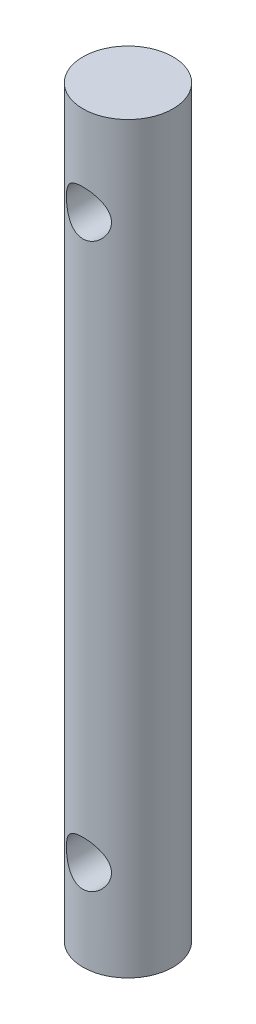
ISO-10303-21;
HEADER;
FILE_DESCRIPTION(('STEP AP214'),'2;1');
FILE_NAME('part.step','',(''),(''),'','','');
FILE_SCHEMA(('AUTOMOTIVE_DESIGN { 1 0 10303 214 1 1 1 1 }'));
ENDSEC;
DATA;
#1=APPLICATION_CONTEXT('core data for automotive mechanical design processes');
#2=APPLICATION_PROTOCOL_DEFINITION('international standard','automotive_design',2000,#1);
#3=PRODUCT_CONTEXT('',#1,'mechanical');
#4=PRODUCT('Part','Part','',(#3));
#5=PRODUCT_RELATED_PRODUCT_CATEGORY('part','',(#4));
#6=PRODUCT_DEFINITION_FORMATION('','',#4);
#7=PRODUCT_DEFINITION_CONTEXT('part definition',#1,'design');
#8=PRODUCT_DEFINITION('design','',#6,#7);
#9=PRODUCT_DEFINITION_SHAPE('','',#8);
#10=(LENGTH_UNIT() NAMED_UNIT(*) SI_UNIT(.MILLI.,.METRE.));
#11=(NAMED_UNIT(*) PLANE_ANGLE_UNIT() SI_UNIT($,.RADIAN.));
#12=(NAMED_UNIT(*) SI_UNIT($,.STERADIAN.) SOLID_ANGLE_UNIT());
#13=UNCERTAINTY_MEASURE_WITH_UNIT(LENGTH_MEASURE(1.E-05),#10,'distance_accuracy_value','');
#14=(GEOMETRIC_REPRESENTATION_CONTEXT(3) GLOBAL_UNCERTAINTY_ASSIGNED_CONTEXT((#13)) GLOBAL_UNIT_ASSIGNED_CONTEXT((#10,
#11,#12)) REPRESENTATION_CONTEXT('',''));
#15=CARTESIAN_POINT('',(0.,0.,0.));
#16=DIRECTION('',(0.,0.,1.));
#17=DIRECTION('',(1.,0.,0.));
#18=AXIS2_PLACEMENT_3D('',#15,#16,#17);
#19=CARTESIAN_POINT('',(0.,104.775,0.767844395721253));
#20=DIRECTION('',(0.,-1.,0.));
#21=DIRECTION('',(0.,0.,-1.));
#22=AXIS2_PLACEMENT_3D('',#19,#20,#21);
#23=CYLINDRICAL_SURFACE('',#22,6.35);
#24=CARTESIAN_POINT('',(0.,95.25,-5.58215560427875));
#25=CARTESIAN_POINT('',(-0.0834969220595,95.2499991122824,-5.58215491594319));
#26=CARTESIAN_POINT('',(-0.167002655580042,95.246700125554,-5.58050319339576));
#27=CARTESIAN_POINT('',(-0.333378330258781,95.2335541254501,-5.57394666249589));
#28=CARTESIAN_POINT('',(-0.416247978955772,95.2237042634742,-5.56904043894988));
#29=CARTESIAN_POINT('',(-0.66318203064701,95.184427934954,-5.549579871762));
#30=CARTESIAN_POINT('',(-0.825450146761555,95.1452749225986,-5.53028387727299));
#31=CARTESIAN_POINT('',(-1.13965128900426,95.0430092887058,-5.48107383563615));
#32=CARTESIAN_POINT('',(-1.29162180811869,94.9799897807566,-5.451201082147));
#33=CARTESIAN_POINT('',(-1.58264035037879,94.8322639263711,-5.38358372469512));
#34=CARTESIAN_POINT('',(-1.72168939123018,94.747559289849,-5.34583974143752));
#35=CARTESIAN_POINT('',(-1.99234108848171,94.5530303702658,-5.26326656610857));
#36=CARTESIAN_POINT('',(-2.12298433900091,94.4419964222061,-5.21814687698693));
#37=CARTESIAN_POINT('',(-2.36467069069853,94.2006033164272,-5.12686096018931));
#38=CARTESIAN_POINT('',(-2.4756988560132,94.0702295702336,-5.08069396496918));
#39=CARTESIAN_POINT('',(-2.68368848497886,93.7815790522467,-4.98839195362339));
#40=CARTESIAN_POINT('',(-2.77889135161933,93.6219224686984,-4.94253706604663));
#41=CARTESIAN_POINT('',(-2.90019349951534,93.3704520128256,-4.88135319714238));
#42=CARTESIAN_POINT('',(-2.93705266116891,93.2845999381713,-4.86221981233808));
#43=CARTESIAN_POINT('',(-3.00322508739606,93.1094143862936,-4.82720165281142));
#44=CARTESIAN_POINT('',(-3.03254280972159,93.0200830018194,-4.81131496011304));
#45=CARTESIAN_POINT('',(-3.08174263292982,92.8439894480352,-4.78428172062924));
#46=CARTESIAN_POINT('',(-3.10208128111978,92.7573892059714,-4.77290989565621));
#47=CARTESIAN_POINT('',(-3.13545600360765,92.5824127210056,-4.75409215314319));
#48=CARTESIAN_POINT('',(-3.14849595237257,92.4940374462283,-4.7466441527901));
#49=CARTESIAN_POINT('',(-3.1670771305344,92.3162932611514,-4.73599436210793));
#50=CARTESIAN_POINT('',(-3.17262287599649,92.2269249820126,-4.73279001454397));
#51=CARTESIAN_POINT('',(-3.17614778806993,92.0480192158219,-4.73075348826484));
#52=CARTESIAN_POINT('',(-3.17412767659871,91.9584817457286,-4.73192089240674));
#53=CARTESIAN_POINT('',(-3.1581193033026,91.7122521242756,-4.74114750790607));
#54=CARTESIAN_POINT('',(-3.13621253452965,91.5561582701866,-4.75376417785582));
#55=CARTESIAN_POINT('',(-3.07003746372168,91.2503533586935,-4.79082053480699));
#56=CARTESIAN_POINT('',(-3.02576203854504,91.1006443509772,-4.81526398785951));
#57=CARTESIAN_POINT('',(-2.91531509833647,90.8074557034358,-4.87373445835111));
#58=CARTESIAN_POINT('',(-2.84865758129417,90.6642023900634,-4.90797144304004));
#59=CARTESIAN_POINT('',(-2.69570761526054,90.390233913826,-4.98218829235508));
#60=CARTESIAN_POINT('',(-2.60940634674629,90.2595244203915,-5.02217073355679));
#61=CARTESIAN_POINT('',(-2.40685964249564,89.9968957257497,-5.10949849446486));
#62=CARTESIAN_POINT('',(-2.28820488335252,89.8669246151435,-5.15713458831811));
#63=CARTESIAN_POINT('',(-2.03058898448426,89.6279148571361,-5.2502926100278));
#64=CARTESIAN_POINT('',(-1.89161819563546,89.5188862136413,-5.29581351966033));
#65=CARTESIAN_POINT('',(-1.58913989972482,89.3200980802803,-5.38219371025555));
#66=CARTESIAN_POINT('',(-1.42479265164788,89.2314685144201,-5.42273835402447));
#67=CARTESIAN_POINT('',(-1.08098023585582,89.0838419183646,-5.49191832727827));
#68=CARTESIAN_POINT('',(-0.901527205073893,89.0248213588683,-5.5205631100682));
#69=CARTESIAN_POINT('',(-0.548533610626834,88.9429405966009,-5.56070320118232));
#70=CARTESIAN_POINT('',(-0.375734359385244,88.9174903274127,-5.5734223955087));
#71=CARTESIAN_POINT('',(-0.0278752299448305,88.8953494777397,-5.584473781442));
#72=CARTESIAN_POINT('',(0.147183538060019,88.8986452728607,-5.58281278864004));
#73=CARTESIAN_POINT('',(0.480164686080361,88.9324062359454,-5.56600095836274));
#74=CARTESIAN_POINT('',(0.638363620564189,88.9607457914748,-5.55190565488306));
#75=CARTESIAN_POINT('',(0.947441883052999,89.0404558782099,-5.51300954351996));
#76=CARTESIAN_POINT('',(1.09832040207141,89.0918289484773,-5.4882075554139));
#77=CARTESIAN_POINT('',(1.39347133182512,89.2174951309378,-5.42925558664208));
#78=CARTESIAN_POINT('',(1.53743151047822,89.2924015841112,-5.39485860038592));
#79=CARTESIAN_POINT('',(1.8112148234104,89.4623164256859,-5.32002678893539));
#80=CARTESIAN_POINT('',(1.94103189959927,89.5573333773854,-5.27958939382555));
#81=CARTESIAN_POINT('',(2.19636241342679,89.7755393503738,-5.19189163137813));
#82=CARTESIAN_POINT('',(2.32020134681979,89.9005786071116,-5.14435119678973));
#83=CARTESIAN_POINT('',(2.54589381918873,90.1697623551497,-5.05073653659243));
#84=CARTESIAN_POINT('',(2.6477321493525,90.3139199523809,-5.00466334391422));
#85=CARTESIAN_POINT('',(2.83117262876716,90.6260686019584,-4.91703095716617));
#86=CARTESIAN_POINT('',(2.91155594998014,90.7948757695104,-4.87579841869696));
#87=CARTESIAN_POINT('',(3.04191297152938,91.1463444648897,-4.80663239965195));
#88=CARTESIAN_POINT('',(3.09192585492219,91.3289877978474,-4.77868179328743));
#89=CARTESIAN_POINT('',(3.15551086037917,91.6841899564701,-4.74273326142477));
#90=CARTESIAN_POINT('',(3.17212027309711,91.8560337504072,-4.73307752771119));
#91=CARTESIAN_POINT('',(3.17718805563876,92.2002444424952,-4.73015561573233));
#92=CARTESIAN_POINT('',(3.16565862768386,92.3726110815426,-4.73688233332315));
#93=CARTESIAN_POINT('',(3.11761548073658,92.6956601030739,-4.76420771905659));
#94=CARTESIAN_POINT('',(3.08358651207686,92.8468439417311,-4.78342383504144));
#95=CARTESIAN_POINT('',(2.99458164828807,93.1411908301672,-4.83193538730456));
#96=CARTESIAN_POINT('',(2.93959901505999,93.2843512828503,-4.8612340655521));
#97=CARTESIAN_POINT('',(2.8061154442137,93.5692336994285,-4.92901136765049));
#98=CARTESIAN_POINT('',(2.7262826050393,93.7102128093657,-4.96797449908407));
#99=CARTESIAN_POINT('',(2.54682759156583,93.9776974317231,-5.04987767510257));
#100=CARTESIAN_POINT('',(2.44719512169931,94.1041953599427,-5.09281978248005));
#101=CARTESIAN_POINT('',(2.21680287661219,94.3550975241771,-5.18408314189078));
#102=CARTESIAN_POINT('',(2.08373188558712,94.4773797564128,-5.23242400305221));
#103=CARTESIAN_POINT('',(1.79751265125244,94.6983978732331,-5.32427906004625));
#104=CARTESIAN_POINT('',(1.64435365457428,94.7971210659827,-5.36779064750917));
#105=CARTESIAN_POINT('',(1.40178715704488,94.925280266197,-5.42606633618117));
#106=CARTESIAN_POINT('',(1.31842200030919,94.9648005836814,-5.44438733699258));
#107=CARTESIAN_POINT('',(1.14807701021671,95.0365994748237,-5.47810923903478));
#108=CARTESIAN_POINT('',(1.06109897786307,95.0688816065344,-5.49351157440578));
#109=CARTESIAN_POINT('',(0.884361322813114,95.125759345915,-5.52090657539856));
#110=CARTESIAN_POINT('',(0.794608244970579,95.1503717181381,-5.53290667237353));
#111=CARTESIAN_POINT('',(0.612925661591588,95.1916673895299,-5.55316543999777));
#112=CARTESIAN_POINT('',(0.520997521680293,95.2083555321935,-5.56142639596235));
#113=CARTESIAN_POINT('',(0.357531347524376,95.2306162848624,-5.57248063691209));
#114=CARTESIAN_POINT('',(0.286274046488597,95.2378788212496,-5.57610231240764));
#115=CARTESIAN_POINT('',(0.143346668941348,95.2475711265376,-5.58094012473442));
#116=CARTESIAN_POINT('',(0.0716765810914261,95.2500007620468,-5.58215619516927));
#117=CARTESIAN_POINT('',(0.,95.25,-5.58215560427875));
#118=B_SPLINE_CURVE_WITH_KNOTS('',3,(#24,#25,#26,#27,#28,#29,#30,#31,#32,#33,#34,#35,#36,#37,
#38,#39,#40,#41,#42,#43,#44,#45,#46,#47,#48,#49,#50,#51,#52,#53,#54,#55,#56,#57,#58,#59,#60,#61,
#62,#63,#64,#65,#66,#67,#68,#69,#70,#71,#72,#73,#74,#75,#76,#77,#78,#79,#80,#81,#82,#83,#84,#85,
#86,#87,#88,#89,#90,#91,#92,#93,#94,#95,#96,#97,#98,#99,#100,#101,#102,#103,#104,#105,#106,#107,
#108,#109,#110,#111,#112,#113,#114,#115,#116,#117),.UNSPECIFIED.,.T.,.F.,(4,2,2,2,2,2,2,2,2,2,2,
2,2,2,2,2,2,2,2,2,2,2,2,2,2,2,2,2,2,2,2,2,2,2,2,2,2,2,2,2,2,2,2,2,2,2,4),(0.,0.25041561210268,
0.500940186864015,1.00234854488129,1.50182051324263,2.00125310940106,2.53090025348451,
3.06094897410614,3.63210298373098,3.91787290005988,4.2034735073285,4.47213270490102,
4.74064915090149,5.00900371453887,5.27733267302576,5.74927594687737,6.22136960256845,
6.70445970327763,7.18776712794021,7.73235646527881,8.27720530143646,8.84735553323666,
9.41705196489304,9.93956405039339,10.4618285011675,10.9436138594975,11.4254523397102,
11.9210677568139,12.4168946391879,12.9614122158798,13.5063050164601,14.0775857365549,
14.6481278321882,15.1639000911419,15.6794487286237,16.1458838633213,16.6124691169503,
17.1104020806943,17.6085946442304,18.1673210354482,18.7263477502426,19.0082017078365,
19.2899168101042,19.5710117490933,19.8519346536844,20.0668939492147,20.2818591776892),.UNSPECIFIED.);
#119=CARTESIAN_POINT('',(0.,95.25,-5.58215560427875));
#120=VERTEX_POINT('',#119);
#121=EDGE_CURVE('E11',#120,#120,#118,.T.);
#122=ORIENTED_EDGE('',*,*,#121,.T.);
#123=EDGE_LOOP('',(#122));
#124=FACE_BOUND('',#123,.T.);
#125=CARTESIAN_POINT('',(3.175,92.075,6.26710570975244));
#126=CARTESIAN_POINT('',(3.17499905676822,91.9922380864674,6.26710672449038));
#127=CARTESIAN_POINT('',(3.17175738528249,91.9094660849583,6.26898254666068));
#128=CARTESIAN_POINT('',(3.15884523354688,91.7445797871413,6.2764051724258));
#129=CARTESIAN_POINT('',(3.1491717603564,91.6624658150491,6.28195368504562));
#130=CARTESIAN_POINT('',(3.11062065473092,91.4178342515892,6.30386118496228));
#131=CARTESIAN_POINT('',(3.07221261154103,91.257171953019,6.32548162314761));
#132=CARTESIAN_POINT('',(2.97211747978078,90.9464021878542,6.37963305070438));
#133=CARTESIAN_POINT('',(2.9105541372517,90.7962435598136,6.41210594158755));
#134=CARTESIAN_POINT('',(2.76627435445934,90.5083885772,6.4841998346217));
#135=CARTESIAN_POINT('',(2.68355676984061,90.3706928973657,6.52382122344217));
#136=CARTESIAN_POINT('',(2.49131627779835,90.0991761786603,6.6097447383962));
#137=CARTESIAN_POINT('',(2.38014521787044,89.9666114027183,6.65632834910434));
#138=CARTESIAN_POINT('',(2.13758083606044,89.7210292087452,6.74865491632271));
#139=CARTESIAN_POINT('',(2.00617748851801,89.608021541095,6.79439744340407));
#140=CARTESIAN_POINT('',(1.71605436473864,89.3973090471499,6.88357626918698));
#141=CARTESIAN_POINT('',(1.55609032527603,89.3011492210603,6.92664926918252));
#142=CARTESIAN_POINT('',(1.21969855929244,89.1376778568886,7.00198090719364));
#143=CARTESIAN_POINT('',(1.04328130884119,89.070348112814,7.03424636728233));
#144=CARTESIAN_POINT('',(0.692292696730408,88.9714226854615,7.08229903885362));
#145=CARTESIAN_POINT('',(0.518483183758187,88.9376252532058,7.0990953920244));
#146=CARTESIAN_POINT('',(0.166911747158865,88.8994725738218,7.11808518354362));
#147=CARTESIAN_POINT('',(-0.0108477196166699,88.8950995122434,7.12028745759956));
#148=CARTESIAN_POINT('',(-0.348718268640206,88.9150707012052,7.11031907022859));
#149=CARTESIAN_POINT('',(-0.509019820270682,88.9369507432159,7.09938163576222));
#150=CARTESIAN_POINT('',(-0.823321212955324,89.0043966354579,7.0662266872537));
#151=CARTESIAN_POINT('',(-0.97732058152526,89.0499642580866,7.04400832913163));
#152=CARTESIAN_POINT('',(-1.27733236684466,89.1637873140228,6.98994214806943));
#153=CARTESIAN_POINT('',(-1.42320480220676,89.2323479205207,6.95796535032441));
#154=CARTESIAN_POINT('',(-1.70172616219331,89.3897857200159,6.88726471977041));
#155=CARTESIAN_POINT('',(-1.83437032813194,89.4786701866477,6.84853847260754));
#156=CARTESIAN_POINT('',(-2.09605211974366,89.683895301586,6.76365365642933));
#157=CARTESIAN_POINT('',(-2.22356359612796,89.8020370904291,6.71713856499948));
#158=CARTESIAN_POINT('',(-2.45777846555886,90.0575623935202,6.62427072879643));
#159=CARTESIAN_POINT('',(-2.56446584928023,90.1949605735396,6.5779181356239));
#160=CARTESIAN_POINT('',(-2.76069102698817,90.4959477683689,6.48741729176472));
#161=CARTESIAN_POINT('',(-2.84870951352546,90.6606459110587,6.44359595324914));
#162=CARTESIAN_POINT('',(-2.95849503046442,90.9188375661308,6.38669686987964));
#163=CARTESIAN_POINT('',(-2.99138760520284,91.0067779285117,6.36919999613122));
#164=CARTESIAN_POINT('',(-3.04938956554735,91.1857974382114,6.33783657320752));
#165=CARTESIAN_POINT('',(-3.07450375064137,91.2768746113191,6.32396778622354));
#166=CARTESIAN_POINT('',(-3.11492823782859,91.4541516314038,6.30139797159841));
#167=CARTESIAN_POINT('',(-3.13085491331031,91.5401706421334,6.29237595800693));
#168=CARTESIAN_POINT('',(-3.15556797554225,91.7135106275881,6.27829753063591));
#169=CARTESIAN_POINT('',(-3.16435807553686,91.8008309011336,6.27323905462891));
#170=CARTESIAN_POINT('',(-3.17466835867007,91.9760151488662,6.26730066102777));
#171=CARTESIAN_POINT('',(-3.17619124884848,92.0638789083904,6.26641918749866));
#172=CARTESIAN_POINT('',(-3.17195985852084,92.2393448376426,6.26885948375423));
#173=CARTESIAN_POINT('',(-3.16620606921981,92.3269470246276,6.2721809698223));
#174=CARTESIAN_POINT('',(-3.14018226453033,92.5690925856452,6.2871002800797));
#175=CARTESIAN_POINT('',(-3.11209439281023,92.7226056075286,6.30313051271152));
#176=CARTESIAN_POINT('',(-3.03433762958359,93.0223468805933,6.34612536495718));
#177=CARTESIAN_POINT('',(-2.98466174914483,93.1685727555203,6.37309352544235));
#178=CARTESIAN_POINT('',(-2.86273054239685,93.4574226266486,6.43637065361084));
#179=CARTESIAN_POINT('',(-2.78953600385262,93.5995661320318,6.47305439342265));
#180=CARTESIAN_POINT('',(-2.62346157669833,93.8703671847707,6.55130086485765));
#181=CARTESIAN_POINT('',(-2.53057157570877,93.9990177534421,6.59286609791076));
#182=CARTESIAN_POINT('',(-2.31405795861388,94.2561568715187,6.68248845012277));
#183=CARTESIAN_POINT('',(-2.18803622695198,94.3825807617025,6.73070343861806));
#184=CARTESIAN_POINT('',(-1.91580928554187,94.6131340475203,6.82365632851185));
#185=CARTESIAN_POINT('',(-1.76959728537411,94.7172559123232,6.86839305214996));
#186=CARTESIAN_POINT('',(-1.45584977269243,94.9025715266821,6.95088263717487));
#187=CARTESIAN_POINT('',(-1.28785333421912,94.9830876368263,6.98842002103909));
#188=CARTESIAN_POINT('',(-0.938283508313605,95.1139128582287,7.05064091345011));
#189=CARTESIAN_POINT('',(-0.756722200806242,95.1642484938744,7.0753357062863));
#190=CARTESIAN_POINT('',(-0.403160492410787,95.2289451905403,7.10728778154941));
#191=CARTESIAN_POINT('',(-0.231811338563334,95.2461832643018,7.11593710898784));
#192=CARTESIAN_POINT('',(0.111525009731682,95.2526773594255,7.11918203295091));
#193=CARTESIAN_POINT('',(0.283511959769308,95.2419431762855,7.11378254917615));
#194=CARTESIAN_POINT('',(0.611308110350745,95.194702940442,7.09034791348882));
#195=CARTESIAN_POINT('',(0.767436553820503,95.1599417201372,7.07316882723711));
#196=CARTESIAN_POINT('',(1.07139095342116,95.0679866606661,7.02869334372406));
#197=CARTESIAN_POINT('',(1.21921571544173,95.0107896045092,7.00139549560217));
#198=CARTESIAN_POINT('',(1.50946910032131,94.8730420621377,6.93769279716902));
#199=CARTESIAN_POINT('',(1.65139651176317,94.7915973718741,6.90094837306771));
#200=CARTESIAN_POINT('',(1.92016030444461,94.6087818456706,6.82219224151419));
#201=CARTESIAN_POINT('',(2.04698971133066,94.5074018577453,6.78017811804515));
#202=CARTESIAN_POINT('',(2.29524860659569,94.2759261687049,6.69012933822699));
#203=CARTESIAN_POINT('',(2.41488454123001,94.1439767688479,6.6419116364774));
#204=CARTESIAN_POINT('',(2.63101905620371,93.8610662694591,6.54834093636534));
#205=CARTESIAN_POINT('',(2.72749716677429,93.7100885287421,6.50299049833465));
#206=CARTESIAN_POINT('',(2.85396050304134,93.4693205187556,6.44056159682022));
#207=CARTESIAN_POINT('',(2.89354057606825,93.3852422772936,6.42041563170917));
#208=CARTESIAN_POINT('',(2.96535747654717,93.2133927754824,6.38307301647894));
#209=CARTESIAN_POINT('',(2.99759808643801,93.1256234451167,6.3658748483282));
#210=CARTESIAN_POINT('',(3.0542719435453,92.9472309915753,6.33515626365955));
#211=CARTESIAN_POINT('',(3.07872527562275,92.8566158831696,6.3216263995258));
#212=CARTESIAN_POINT('',(3.11956903021308,92.6731115214591,6.29878826592036));
#213=CARTESIAN_POINT('',(3.13596509002515,92.5802239060257,6.28947704521671));
#214=CARTESIAN_POINT('',(3.15710761797221,92.4185362512041,6.27740631722533));
#215=CARTESIAN_POINT('',(3.16381073091702,92.3500663272401,6.27355307977905));
#216=CARTESIAN_POINT('',(3.17275746355016,92.212733281387,6.26840226835251));
#217=CARTESIAN_POINT('',(3.17500078490812,92.1438701335028,6.26710486534062));
#218=CARTESIAN_POINT('',(3.175,92.075,6.26710570975244));
#219=B_SPLINE_CURVE_WITH_KNOTS('',3,(#125,#126,#127,#128,#129,#130,#131,#132,#133,#134,#135,
#136,#137,#138,#139,#140,#141,#142,#143,#144,#145,#146,#147,#148,#149,#150,#151,#152,#153,#154,
#155,#156,#157,#158,#159,#160,#161,#162,#163,#164,#165,#166,#167,#168,#169,#170,#171,#172,#173,
#174,#175,#176,#177,#178,#179,#180,#181,#182,#183,#184,#185,#186,#187,#188,#189,#190,#191,#192,
#193,#194,#195,#196,#197,#198,#199,#200,#201,#202,#203,#204,#205,#206,#207,#208,#209,#210,#211,
#212,#213,#214,#215,#216,#217,#218),.UNSPECIFIED.,.T.,.F.,(4,2,2,2,2,2,2,2,2,2,2,2,2,2,2,2,2,2,
2,2,2,2,2,2,2,2,2,2,2,2,2,2,2,2,2,2,2,2,2,2,2,2,2,2,2,2,4),(0.,0.248210314193387,
0.496536210172851,0.993616655653378,1.48807751301479,1.98256512428753,2.51783706318106,
3.05337510292795,3.62501229957991,4.19628797710271,4.72691486873111,5.25722047303094,
5.74141031613326,6.22563639342838,6.71656194871308,7.2076634753703,7.74518754975544,
8.28312325280708,8.85521994590916,9.14138502893468,9.42737318655796,9.69083660833535,
9.95416285897607,10.2173910127766,10.4806013985705,10.9489167635524,11.4173838546846,
11.9075481007329,12.3979646273261,12.9502005485241,13.5026226528976,14.0696241997013,
14.6361266987681,15.1506510247058,15.6649951955482,16.1454469295095,16.625967578846,
17.1270402751828,17.6283435455375,18.1795366185793,18.7312151251733,19.0161455987001,
19.3009288973909,19.5849716229022,19.8688153329579,20.075349152287,20.2818967868888),.UNSPECIFIED.);
#220=CARTESIAN_POINT('',(3.175,92.075,6.26710570975244));
#221=VERTEX_POINT('',#220);
#222=EDGE_CURVE('E62',#221,#221,#219,.T.);
#223=ORIENTED_EDGE('',*,*,#222,.T.);
#224=EDGE_LOOP('',(#223));
#225=FACE_BOUND('',#224,.T.);
#226=CARTESIAN_POINT('',(0.,15.875,-5.58215560427875));
#227=CARTESIAN_POINT('',(-0.0834969220594996,15.8749991122824,-5.58215491594319));
#228=CARTESIAN_POINT('',(-0.167002655580042,15.871700125554,-5.58050319339576));
#229=CARTESIAN_POINT('',(-0.33337833025878,15.8585541254501,-5.57394666249589));
#230=CARTESIAN_POINT('',(-0.416247978955771,15.8487042634742,-5.56904043894988));
#231=CARTESIAN_POINT('',(-0.663182030647009,15.809427934954,-5.549579871762));
#232=CARTESIAN_POINT('',(-0.825450146761554,15.7702749225986,-5.53028387727299));
#233=CARTESIAN_POINT('',(-1.13965128900426,15.6680092887058,-5.48107383563615));
#234=CARTESIAN_POINT('',(-1.29162180811868,15.6049897807566,-5.451201082147));
#235=CARTESIAN_POINT('',(-1.58264035037879,15.4572639263711,-5.38358372469512));
#236=CARTESIAN_POINT('',(-1.72168939123018,15.372559289849,-5.34583974143752));
#237=CARTESIAN_POINT('',(-1.99234108848171,15.1780303702658,-5.26326656610857));
#238=CARTESIAN_POINT('',(-2.12298433900091,15.0669964222061,-5.21814687698693));
#239=CARTESIAN_POINT('',(-2.36467069069853,14.8256033164272,-5.12686096018931));
#240=CARTESIAN_POINT('',(-2.47569885601321,14.6952295702336,-5.08069396496918));
#241=CARTESIAN_POINT('',(-2.68368848497886,14.4065790522467,-4.98839195362339));
#242=CARTESIAN_POINT('',(-2.77889135161933,14.2469224686984,-4.94253706604663));
#243=CARTESIAN_POINT('',(-2.90019349951534,13.9954520128256,-4.88135319714238));
#244=CARTESIAN_POINT('',(-2.93705266116891,13.9095999381713,-4.86221981233808));
#245=CARTESIAN_POINT('',(-3.00322508739606,13.7344143862936,-4.82720165281142));
#246=CARTESIAN_POINT('',(-3.03254280972158,13.6450830018194,-4.81131496011304));
#247=CARTESIAN_POINT('',(-3.08174263292982,13.4689894480353,-4.78428172062924));
#248=CARTESIAN_POINT('',(-3.10208128111978,13.3823892059714,-4.77290989565621));
#249=CARTESIAN_POINT('',(-3.13545600360764,13.2074127210056,-4.75409215314319));
#250=CARTESIAN_POINT('',(-3.14849595237257,13.1190374462283,-4.7466441527901));
#251=CARTESIAN_POINT('',(-3.1670771305344,12.9412932611514,-4.73599436210794));
#252=CARTESIAN_POINT('',(-3.17262287599649,12.8519249820126,-4.73279001454397));
#253=CARTESIAN_POINT('',(-3.17614778806993,12.6730192158219,-4.73075348826484));
#254=CARTESIAN_POINT('',(-3.17412767659871,12.5834817457287,-4.73192089240674));
#255=CARTESIAN_POINT('',(-3.1581193033026,12.3372521242756,-4.74114750790608));
#256=CARTESIAN_POINT('',(-3.13621253452965,12.1811582701866,-4.75376417785582));
#257=CARTESIAN_POINT('',(-3.07003746372167,11.8753533586935,-4.79082053480699));
#258=CARTESIAN_POINT('',(-3.02576203854504,11.7256443509772,-4.81526398785952));
#259=CARTESIAN_POINT('',(-2.91531509833646,11.4324557034359,-4.87373445835112));
#260=CARTESIAN_POINT('',(-2.84865758129417,11.2892023900634,-4.90797144304004));
#261=CARTESIAN_POINT('',(-2.69570761526053,11.015233913826,-4.98218829235508));
#262=CARTESIAN_POINT('',(-2.60940634674628,10.8845244203915,-5.02217073355679));
#263=CARTESIAN_POINT('',(-2.40685964249564,10.6218957257497,-5.10949849446486));
#264=CARTESIAN_POINT('',(-2.28820488335252,10.4919246151435,-5.15713458831811));
#265=CARTESIAN_POINT('',(-2.03058898448426,10.2529148571362,-5.2502926100278));
#266=CARTESIAN_POINT('',(-1.89161819563545,10.1438862136413,-5.29581351966033));
#267=CARTESIAN_POINT('',(-1.58913989972482,9.94509808028028,-5.38219371025555));
#268=CARTESIAN_POINT('',(-1.42479265164787,9.85646851442005,-5.42273835402447));
#269=CARTESIAN_POINT('',(-1.08098023585582,9.70884191836465,-5.49191832727827));
#270=CARTESIAN_POINT('',(-0.901527205073886,9.64982135886829,-5.52056311006821));
#271=CARTESIAN_POINT('',(-0.548533610626825,9.56794059660095,-5.56070320118232));
#272=CARTESIAN_POINT('',(-0.375734359385236,9.54249032741266,-5.5734223955087));
#273=CARTESIAN_POINT('',(-0.0278752299448229,9.52034947773974,-5.584473781442));
#274=CARTESIAN_POINT('',(0.147183538060028,9.52364527286068,-5.58281278864004));
#275=CARTESIAN_POINT('',(0.480164686080371,9.55740623594539,-5.56600095836274));
#276=CARTESIAN_POINT('',(0.638363620564199,9.58574579147484,-5.55190565488305));
#277=CARTESIAN_POINT('',(0.947441883053009,9.6654558782099,-5.51300954351996));
#278=CARTESIAN_POINT('',(1.09832040207142,9.71682894847729,-5.4882075554139));
#279=CARTESIAN_POINT('',(1.39347133182513,9.8424951309378,-5.42925558664208));
#280=CARTESIAN_POINT('',(1.53743151047823,9.9174015841112,-5.39485860038592));
#281=CARTESIAN_POINT('',(1.81121482341041,10.0873164256859,-5.32002678893539));
#282=CARTESIAN_POINT('',(1.94103189959928,10.1823333773854,-5.27958939382554));
#283=CARTESIAN_POINT('',(2.1963624134268,10.4005393503738,-5.19189163137813));
#284=CARTESIAN_POINT('',(2.32020134681981,10.5255786071116,-5.14435119678972));
#285=CARTESIAN_POINT('',(2.54589381918874,10.7947623551498,-5.05073653659243));
#286=CARTESIAN_POINT('',(2.64773214935251,10.9389199523809,-5.00466334391421));
#287=CARTESIAN_POINT('',(2.83117262876717,11.2510686019584,-4.91703095716616));
#288=CARTESIAN_POINT('',(2.91155594998015,11.4198757695104,-4.87579841869695));
#289=CARTESIAN_POINT('',(3.04191297152939,11.7713444648897,-4.80663239965194));
#290=CARTESIAN_POINT('',(3.0919258549222,11.9539877978474,-4.77868179328743));
#291=CARTESIAN_POINT('',(3.15551086037918,12.3091899564702,-4.74273326142477));
#292=CARTESIAN_POINT('',(3.17212027309712,12.4810337504072,-4.73307752771119));
#293=CARTESIAN_POINT('',(3.17718805563877,12.8252444424952,-4.73015561573233));
#294=CARTESIAN_POINT('',(3.16565862768386,12.9976110815426,-4.73688233332315));
#295=CARTESIAN_POINT('',(3.11761548073658,13.3206601030739,-4.76420771905659));
#296=CARTESIAN_POINT('',(3.08358651207687,13.4718439417311,-4.78342383504144));
#297=CARTESIAN_POINT('',(2.99458164828807,13.7661908301672,-4.83193538730456));
#298=CARTESIAN_POINT('',(2.93959901505999,13.9093512828503,-4.86123406555209));
#299=CARTESIAN_POINT('',(2.8061154442137,14.1942336994285,-4.92901136765049));
#300=CARTESIAN_POINT('',(2.72628260503929,14.3352128093657,-4.96797449908407));
#301=CARTESIAN_POINT('',(2.54682759156583,14.6026974317231,-5.04987767510257));
#302=CARTESIAN_POINT('',(2.44719512169931,14.7291953599427,-5.09281978248005));
#303=CARTESIAN_POINT('',(2.21680287661219,14.9800975241771,-5.18408314189078));
#304=CARTESIAN_POINT('',(2.08373188558713,15.1023797564128,-5.23242400305221));
#305=CARTESIAN_POINT('',(1.79751265125244,15.3233978732331,-5.32427906004625));
#306=CARTESIAN_POINT('',(1.64435365457428,15.4221210659827,-5.36779064750917));
#307=CARTESIAN_POINT('',(1.40178715704487,15.5502802661971,-5.42606633618117));
#308=CARTESIAN_POINT('',(1.31842200030919,15.5898005836814,-5.44438733699258));
#309=CARTESIAN_POINT('',(1.14807701021671,15.6615994748237,-5.47810923903478));
#310=CARTESIAN_POINT('',(1.06109897786306,15.6938816065344,-5.49351157440578));
#311=CARTESIAN_POINT('',(0.884361322813111,15.750759345915,-5.52090657539856));
#312=CARTESIAN_POINT('',(0.794608244970574,15.7753717181381,-5.53290667237353));
#313=CARTESIAN_POINT('',(0.612925661591584,15.8166673895299,-5.55316543999778));
#314=CARTESIAN_POINT('',(0.520997521680292,15.8333555321935,-5.56142639596235));
#315=CARTESIAN_POINT('',(0.357531347524376,15.8556162848624,-5.57248063691209));
#316=CARTESIAN_POINT('',(0.286274046488597,15.8628788212496,-5.57610231240764));
#317=CARTESIAN_POINT('',(0.143346668941347,15.8725711265376,-5.58094012473442));
#318=CARTESIAN_POINT('',(0.0716765810914259,15.8750007620468,-5.58215619516927));
#319=CARTESIAN_POINT('',(0.,15.875,-5.58215560427875));
#320=B_SPLINE_CURVE_WITH_KNOTS('',3,(#226,#227,#228,#229,#230,#231,#232,#233,#234,#235,#236,
#237,#238,#239,#240,#241,#242,#243,#244,#245,#246,#247,#248,#249,#250,#251,#252,#253,#254,#255,
#256,#257,#258,#259,#260,#261,#262,#263,#264,#265,#266,#267,#268,#269,#270,#271,#272,#273,#274,
#275,#276,#277,#278,#279,#280,#281,#282,#283,#284,#285,#286,#287,#288,#289,#290,#291,#292,#293,
#294,#295,#296,#297,#298,#299,#300,#301,#302,#303,#304,#305,#306,#307,#308,#309,#310,#311,#312,
#313,#314,#315,#316,#317,#318,#319),.UNSPECIFIED.,.T.,.F.,(4,2,2,2,2,2,2,2,2,2,2,2,2,2,2,2,2,2,
2,2,2,2,2,2,2,2,2,2,2,2,2,2,2,2,2,2,2,2,2,2,2,2,2,2,2,2,4),(0.,0.25041561210268,
0.500940186864013,1.00234854488129,1.50182051324263,2.00125310940106,2.53090025348452,
3.06094897410615,3.63210298373098,3.91787290005989,4.20347350732849,4.47213270490102,
4.74064915090148,5.00900371453887,5.27733267302576,5.74927594687738,6.22136960256846,
6.70445970327764,7.18776712794021,7.73235646527881,8.27720530143646,8.84735553323666,
9.41705196489304,9.93956405039339,10.4618285011675,10.9436138594975,11.4254523397102,
11.9210677568139,12.4168946391879,12.9614122158798,13.5063050164601,14.0775857365549,
14.6481278321882,15.1639000911419,15.6794487286237,16.1458838633213,16.6124691169503,
17.1104020806943,17.6085946442304,18.1673210354482,18.7263477502426,19.0082017078365,
19.2899168101042,19.5710117490933,19.8519346536844,20.0668939492148,20.2818591776892),.UNSPECIFIED.);
#321=CARTESIAN_POINT('',(0.,15.875,-5.58215560427875));
#322=VERTEX_POINT('',#321);
#323=EDGE_CURVE('E43',#322,#322,#320,.T.);
#324=ORIENTED_EDGE('',*,*,#323,.T.);
#325=EDGE_LOOP('',(#324));
#326=FACE_BOUND('',#325,.T.);
#327=CARTESIAN_POINT('',(3.17500000000001,12.7,6.26710570975244));
#328=CARTESIAN_POINT('',(3.17499905676823,12.6172380864675,6.26710672449038));
#329=CARTESIAN_POINT('',(3.1717573852825,12.5344660849583,6.26898254666067));
#330=CARTESIAN_POINT('',(3.15884523354689,12.3695797871413,6.2764051724258));
#331=CARTESIAN_POINT('',(3.14917176035641,12.2874658150492,6.28195368504562));
#332=CARTESIAN_POINT('',(3.11062065473093,12.0428342515892,6.30386118496227));
#333=CARTESIAN_POINT('',(3.07221261154103,11.882171953019,6.32548162314761));
#334=CARTESIAN_POINT('',(2.97211747978078,11.5714021878542,6.37963305070438));
#335=CARTESIAN_POINT('',(2.9105541372517,11.4212435598136,6.41210594158755));
#336=CARTESIAN_POINT('',(2.76627435445935,11.1333885772,6.4841998346217));
#337=CARTESIAN_POINT('',(2.68355676984061,10.9956928973657,6.52382122344217));
#338=CARTESIAN_POINT('',(2.49131627779835,10.7241761786603,6.6097447383962));
#339=CARTESIAN_POINT('',(2.38014521787044,10.5916114027183,6.65632834910434));
#340=CARTESIAN_POINT('',(2.13758083606043,10.3460292087452,6.74865491632271));
#341=CARTESIAN_POINT('',(2.00617748851801,10.233021541095,6.79439744340407));
#342=CARTESIAN_POINT('',(1.71605436473864,10.0223090471499,6.88357626918698));
#343=CARTESIAN_POINT('',(1.55609032527603,9.92614922106035,6.92664926918252));
#344=CARTESIAN_POINT('',(1.21969855929244,9.76267785688862,7.00198090719364));
#345=CARTESIAN_POINT('',(1.0432813088412,9.69534811281404,7.03424636728234));
#346=CARTESIAN_POINT('',(0.692292696730409,9.59642268546146,7.08229903885362));
#347=CARTESIAN_POINT('',(0.518483183758185,9.56262525320581,7.0990953920244));
#348=CARTESIAN_POINT('',(0.166911747158861,9.52447257382175,7.11808518354362));
#349=CARTESIAN_POINT('',(-0.0108477196166729,9.52009951224336,7.12028745759956));
#350=CARTESIAN_POINT('',(-0.348718268640207,9.54007070120517,7.11031907022859));
#351=CARTESIAN_POINT('',(-0.509019820270683,9.56195074321593,7.09938163576222));
#352=CARTESIAN_POINT('',(-0.823321212955323,9.62939663545795,7.0662266872537));
#353=CARTESIAN_POINT('',(-0.977320581525258,9.67496425808659,7.04400832913163));
#354=CARTESIAN_POINT('',(-1.27733236684465,9.7887873140228,6.98994214806944));
#355=CARTESIAN_POINT('',(-1.42320480220676,9.85734792052068,6.95796535032441));
#356=CARTESIAN_POINT('',(-1.7017261621933,10.0147857200159,6.88726471977041));
#357=CARTESIAN_POINT('',(-1.83437032813193,10.1036701866477,6.84853847260754));
#358=CARTESIAN_POINT('',(-2.09605211974366,10.308895301586,6.76365365642933));
#359=CARTESIAN_POINT('',(-2.22356359612796,10.4270370904291,6.71713856499948));
#360=CARTESIAN_POINT('',(-2.45777846555886,10.6825623935202,6.62427072879643));
#361=CARTESIAN_POINT('',(-2.56446584928023,10.8199605735396,6.5779181356239));
#362=CARTESIAN_POINT('',(-2.76069102698817,11.1209477683689,6.48741729176472));
#363=CARTESIAN_POINT('',(-2.84870951352546,11.2856459110587,6.44359595324915));
#364=CARTESIAN_POINT('',(-2.95849503046442,11.5438375661308,6.38669686987964));
#365=CARTESIAN_POINT('',(-2.99138760520284,11.6317779285117,6.36919999613122));
#366=CARTESIAN_POINT('',(-3.04938956554735,11.8107974382114,6.33783657320752));
#367=CARTESIAN_POINT('',(-3.07450375064137,11.9018746113191,6.32396778622355));
#368=CARTESIAN_POINT('',(-3.11492823782858,12.0791516314038,6.30139797159841));
#369=CARTESIAN_POINT('',(-3.13085491331031,12.1651706421334,6.29237595800693));
#370=CARTESIAN_POINT('',(-3.15556797554224,12.3385106275881,6.27829753063591));
#371=CARTESIAN_POINT('',(-3.16435807553685,12.4258309011336,6.27323905462891));
#372=CARTESIAN_POINT('',(-3.17466835867006,12.6010151488662,6.26730066102777));
#373=CARTESIAN_POINT('',(-3.17619124884848,12.6888789083904,6.26641918749866));
#374=CARTESIAN_POINT('',(-3.17195985852084,12.8643448376426,6.26885948375424));
#375=CARTESIAN_POINT('',(-3.16620606921981,12.9519470246276,6.2721809698223));
#376=CARTESIAN_POINT('',(-3.14018226453033,13.1940925856452,6.28710028007971));
#377=CARTESIAN_POINT('',(-3.11209439281023,13.3476056075286,6.30313051271152));
#378=CARTESIAN_POINT('',(-3.03433762958359,13.6473468805933,6.34612536495718));
#379=CARTESIAN_POINT('',(-2.98466174914483,13.7935727555203,6.37309352544235));
#380=CARTESIAN_POINT('',(-2.86273054239684,14.0824226266486,6.43637065361084));
#381=CARTESIAN_POINT('',(-2.78953600385261,14.2245661320318,6.47305439342265));
#382=CARTESIAN_POINT('',(-2.62346157669832,14.4953671847707,6.55130086485766));
#383=CARTESIAN_POINT('',(-2.53057157570876,14.6240177534421,6.59286609791076));
#384=CARTESIAN_POINT('',(-2.31405795861387,14.8811568715187,6.68248845012278));
#385=CARTESIAN_POINT('',(-2.18803622695198,15.0075807617025,6.73070343861806));
#386=CARTESIAN_POINT('',(-1.91580928554186,15.2381340475204,6.82365632851185));
#387=CARTESIAN_POINT('',(-1.76959728537411,15.3422559123232,6.86839305214996));
#388=CARTESIAN_POINT('',(-1.45584977269243,15.5275715266821,6.95088263717488));
#389=CARTESIAN_POINT('',(-1.28785333421912,15.6080876368263,6.98842002103909));
#390=CARTESIAN_POINT('',(-0.938283508313603,15.7389128582287,7.05064091345011));
#391=CARTESIAN_POINT('',(-0.756722200806239,15.7892484938744,7.0753357062863));
#392=CARTESIAN_POINT('',(-0.403160492410781,15.8539451905403,7.10728778154941));
#393=CARTESIAN_POINT('',(-0.231811338563328,15.8711832643018,7.11593710898784));
#394=CARTESIAN_POINT('',(0.111525009731688,15.8776773594255,7.11918203295091));
#395=CARTESIAN_POINT('',(0.283511959769315,15.8669431762855,7.11378254917615));
#396=CARTESIAN_POINT('',(0.611308110350751,15.819702940442,7.09034791348881));
#397=CARTESIAN_POINT('',(0.76743655382051,15.7849417201372,7.07316882723711));
#398=CARTESIAN_POINT('',(1.07139095342117,15.6929866606661,7.02869334372406));
#399=CARTESIAN_POINT('',(1.21921571544173,15.6357896045092,7.00139549560217));
#400=CARTESIAN_POINT('',(1.50946910032132,15.4980420621378,6.93769279716902));
#401=CARTESIAN_POINT('',(1.65139651176319,15.4165973718741,6.90094837306771));
#402=CARTESIAN_POINT('',(1.92016030444463,15.2337818456706,6.82219224151418));
#403=CARTESIAN_POINT('',(2.04698971133067,15.1324018577453,6.78017811804515));
#404=CARTESIAN_POINT('',(2.29524860659569,14.9009261687049,6.69012933822698));
#405=CARTESIAN_POINT('',(2.41488454123002,14.7689767688479,6.6419116364774));
#406=CARTESIAN_POINT('',(2.63101905620372,14.4860662694591,6.54834093636534));
#407=CARTESIAN_POINT('',(2.7274971667743,14.3350885287421,6.50299049833464));
#408=CARTESIAN_POINT('',(2.85396050304135,14.0943205187556,6.44056159682021));
#409=CARTESIAN_POINT('',(2.89354057606826,14.0102422772936,6.42041563170916));
#410=CARTESIAN_POINT('',(2.96535747654718,13.8383927754824,6.38307301647893));
#411=CARTESIAN_POINT('',(2.99759808643802,13.7506234451167,6.36587484832819));
#412=CARTESIAN_POINT('',(3.05427194354531,13.5722309915753,6.33515626365955));
#413=CARTESIAN_POINT('',(3.07872527562276,13.4816158831696,6.3216263995258));
#414=CARTESIAN_POINT('',(3.11956903021309,13.2981115214591,6.29878826592036));
#415=CARTESIAN_POINT('',(3.13596509002516,13.2052239060257,6.28947704521671));
#416=CARTESIAN_POINT('',(3.15710761797221,13.0435362512041,6.27740631722533));
#417=CARTESIAN_POINT('',(3.16381073091703,12.9750663272401,6.27355307977905));
#418=CARTESIAN_POINT('',(3.17275746355017,12.837733281387,6.26840226835251));
#419=CARTESIAN_POINT('',(3.17500078490813,12.7688701335028,6.26710486534062));
#420=CARTESIAN_POINT('',(3.17500000000001,12.7,6.26710570975244));
#421=B_SPLINE_CURVE_WITH_KNOTS('',3,(#327,#328,#329,#330,#331,#332,#333,#334,#335,#336,#337,
#338,#339,#340,#341,#342,#343,#344,#345,#346,#347,#348,#349,#350,#351,#352,#353,#354,#355,#356,
#357,#358,#359,#360,#361,#362,#363,#364,#365,#366,#367,#368,#369,#370,#371,#372,#373,#374,#375,
#376,#377,#378,#379,#380,#381,#382,#383,#384,#385,#386,#387,#388,#389,#390,#391,#392,#393,#394,
#395,#396,#397,#398,#399,#400,#401,#402,#403,#404,#405,#406,#407,#408,#409,#410,#411,#412,#413,
#414,#415,#416,#417,#418,#419,#420),.UNSPECIFIED.,.T.,.F.,(4,2,2,2,2,2,2,2,2,2,2,2,2,2,2,2,2,2,
2,2,2,2,2,2,2,2,2,2,2,2,2,2,2,2,2,2,2,2,2,2,2,2,2,2,2,2,4),(0.,0.248210314193369,
0.496536210172844,0.993616655653378,1.48807751301481,1.98256512428753,2.51783706318107,
3.05337510292796,3.62501229957992,4.19628797710272,4.72691486873112,5.25722047303095,
5.74141031613327,6.22563639342838,6.71656194871309,7.20766347537031,7.74518754975546,
8.28312325280709,8.85521994590916,9.14138502893469,9.42737318655796,9.69083660833536,
9.95416285897606,10.2173910127766,10.4806013985705,10.9489167635524,11.4173838546846,
11.9075481007329,12.3979646273261,12.9502005485241,13.5026226528976,14.0696241997013,
14.6361266987681,15.1506510247058,15.6649951955482,16.1454469295095,16.625967578846,
17.1270402751829,17.6283435455375,18.1795366185793,18.7312151251733,19.0161455987001,
19.3009288973909,19.5849716229022,19.8688153329579,20.075349152287,20.2818967868888),.UNSPECIFIED.);
#422=CARTESIAN_POINT('',(3.17500000000001,12.7,6.26710570975244));
#423=VERTEX_POINT('',#422);
#424=EDGE_CURVE('E58',#423,#423,#421,.T.);
#425=ORIENTED_EDGE('',*,*,#424,.T.);
#426=EDGE_LOOP('',(#425));
#427=FACE_BOUND('',#426,.T.);
#428=CARTESIAN_POINT('',(0.,104.775,0.767844395721253));
#429=DIRECTION('',(0.,1.,0.));
#430=DIRECTION('',(0.,0.,1.));
#431=AXIS2_PLACEMENT_3D('',#428,#429,#430);
#432=CIRCLE('',#431,6.35);
#433=CARTESIAN_POINT('',(0.,104.775,7.11784439572125));
#434=VERTEX_POINT('',#433);
#435=EDGE_CURVE('E47',#434,#434,#432,.T.);
#436=ORIENTED_EDGE('',*,*,#435,.F.);
#437=EDGE_LOOP('',(#436));
#438=FACE_BOUND('',#437,.T.);
#439=CARTESIAN_POINT('',(0.,0.,0.767844395721253));
#440=DIRECTION('',(0.,1.,0.));
#441=DIRECTION('',(0.,0.,1.));
#442=AXIS2_PLACEMENT_3D('',#439,#440,#441);
#443=CIRCLE('',#442,6.35);
#444=CARTESIAN_POINT('',(0.,0.,7.11784439572125));
#445=VERTEX_POINT('',#444);
#446=EDGE_CURVE('E52',#445,#445,#443,.T.);
#447=ORIENTED_EDGE('',*,*,#446,.T.);
#448=EDGE_LOOP('',(#447));
#449=FACE_BOUND('',#448,.T.);
#450=ADVANCED_FACE('F33',(#124,#225,#326,#427,#438,#449),#23,.T.);
#451=CARTESIAN_POINT('',(0.,104.775,0.767844395721253));
#452=DIRECTION('',(0.,1.,0.));
#453=DIRECTION('',(0.,0.,1.));
#454=AXIS2_PLACEMENT_3D('',#451,#452,#453);
#455=PLANE('',#454);
#456=ORIENTED_EDGE('',*,*,#435,.T.);
#457=EDGE_LOOP('',(#456));
#458=FACE_BOUND('',#457,.T.);
#459=ADVANCED_FACE('F73',(#458),#455,.T.);
#460=CARTESIAN_POINT('',(0.,0.,0.767844395721253));
#461=DIRECTION('',(0.,1.,0.));
#462=DIRECTION('',(0.,0.,1.));
#463=AXIS2_PLACEMENT_3D('',#460,#461,#462);
#464=PLANE('',#463);
#465=ORIENTED_EDGE('',*,*,#446,.F.);
#466=EDGE_LOOP('',(#465));
#467=FACE_BOUND('',#466,.T.);
#468=ADVANCED_FACE('F70',(#467),#464,.F.);
#469=CARTESIAN_POINT('',(0.,12.7,-5.58215560427875));
#470=DIRECTION('',(0.,0.,1.));
#471=DIRECTION('',(1.,0.,0.));
#472=AXIS2_PLACEMENT_3D('',#469,#470,#471);
#473=CYLINDRICAL_SURFACE('',#472,3.175);
#474=ORIENTED_EDGE('',*,*,#424,.F.);
#475=EDGE_LOOP('',(#474));
#476=FACE_BOUND('',#475,.T.);
#477=ORIENTED_EDGE('',*,*,#323,.F.);
#478=EDGE_LOOP('',(#477));
#479=FACE_BOUND('',#478,.T.);
#480=ADVANCED_FACE('F65',(#476,#479),#473,.F.);
#481=CARTESIAN_POINT('',(0.,92.075,-5.58215560427875));
#482=DIRECTION('',(0.,0.,1.));
#483=DIRECTION('',(1.,0.,0.));
#484=AXIS2_PLACEMENT_3D('',#481,#482,#483);
#485=CYLINDRICAL_SURFACE('',#484,3.175);
#486=ORIENTED_EDGE('',*,*,#222,.F.);
#487=EDGE_LOOP('',(#486));
#488=FACE_BOUND('',#487,.T.);
#489=ORIENTED_EDGE('',*,*,#121,.F.);
#490=EDGE_LOOP('',(#489));
#491=FACE_BOUND('',#490,.T.);
#492=ADVANCED_FACE('F69',(#488,#491),#485,.F.);
#493=CLOSED_SHELL('',(#450,#459,#468,#480,#492));
#494=MANIFOLD_SOLID_BREP('B2',#493);
#495=ADVANCED_BREP_SHAPE_REPRESENTATION('',(#18,#494),#14);
#496=SHAPE_DEFINITION_REPRESENTATION(#9,#495);
ENDSEC;
END-ISO-10303-21;
